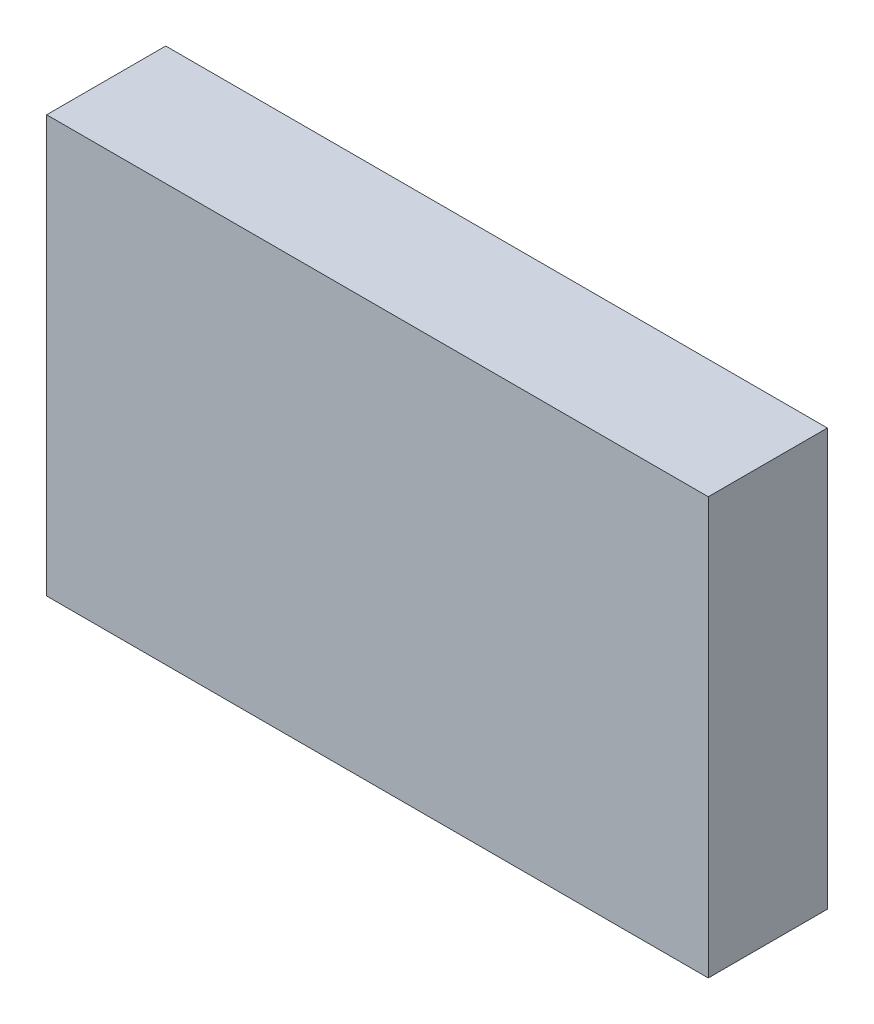
ISO-10303-21;
HEADER;
FILE_DESCRIPTION(('STEP AP214'),'2;1');
FILE_NAME('part.step','',(''),(''),'','','');
FILE_SCHEMA(('AUTOMOTIVE_DESIGN { 1 0 10303 214 1 1 1 1 }'));
ENDSEC;
DATA;
#1=APPLICATION_CONTEXT('core data for automotive mechanical design processes');
#2=APPLICATION_PROTOCOL_DEFINITION('international standard','automotive_design',2000,#1);
#3=PRODUCT_CONTEXT('',#1,'mechanical');
#4=PRODUCT('Part','Part','',(#3));
#5=PRODUCT_RELATED_PRODUCT_CATEGORY('part','',(#4));
#6=PRODUCT_DEFINITION_FORMATION('','',#4);
#7=PRODUCT_DEFINITION_CONTEXT('part definition',#1,'design');
#8=PRODUCT_DEFINITION('design','',#6,#7);
#9=PRODUCT_DEFINITION_SHAPE('','',#8);
#10=(LENGTH_UNIT() NAMED_UNIT(*) SI_UNIT(.MILLI.,.METRE.));
#11=(NAMED_UNIT(*) PLANE_ANGLE_UNIT() SI_UNIT($,.RADIAN.));
#12=(NAMED_UNIT(*) SI_UNIT($,.STERADIAN.) SOLID_ANGLE_UNIT());
#13=UNCERTAINTY_MEASURE_WITH_UNIT(LENGTH_MEASURE(1.E-05),#10,'distance_accuracy_value','');
#14=(GEOMETRIC_REPRESENTATION_CONTEXT(3) GLOBAL_UNCERTAINTY_ASSIGNED_CONTEXT((#13)) GLOBAL_UNIT_ASSIGNED_CONTEXT((#10,
#11,#12)) REPRESENTATION_CONTEXT('',''));
#15=CARTESIAN_POINT('',(0.,0.,0.));
#16=DIRECTION('',(0.,0.,1.));
#17=DIRECTION('',(1.,0.,0.));
#18=AXIS2_PLACEMENT_3D('',#15,#16,#17);
#19=CARTESIAN_POINT('',(3.175,2.,1.143));
#20=DIRECTION('',(-1.,0.,0.));
#21=DIRECTION('',(0.,-1.,0.));
#22=AXIS2_PLACEMENT_3D('',#19,#20,#21);
#23=PLANE('',#22);
#24=DIRECTION('',(0.,1.,0.));
#25=VECTOR('',#24,1.);
#26=CARTESIAN_POINT('',(3.175,2.,0.));
#27=LINE('',#26,#25);
#28=CARTESIAN_POINT('',(3.175,-2.,0.));
#29=VERTEX_POINT('',#28);
#30=CARTESIAN_POINT('',(3.175,2.,0.));
#31=VERTEX_POINT('',#30);
#32=EDGE_CURVE('E96',#29,#31,#27,.T.);
#33=ORIENTED_EDGE('',*,*,#32,.T.);
#34=DIRECTION('',(0.,0.,-1.));
#35=VECTOR('',#34,1.);
#36=CARTESIAN_POINT('',(3.175,2.,1.143));
#37=LINE('',#36,#35);
#38=CARTESIAN_POINT('',(3.175,2.,1.143));
#39=VERTEX_POINT('',#38);
#40=EDGE_CURVE('E11',#39,#31,#37,.T.);
#41=ORIENTED_EDGE('',*,*,#40,.F.);
#42=DIRECTION('',(0.,1.,0.));
#43=VECTOR('',#42,1.);
#44=CARTESIAN_POINT('',(3.175,2.,1.143));
#45=LINE('',#44,#43);
#46=CARTESIAN_POINT('',(3.175,-2.,1.143));
#47=VERTEX_POINT('',#46);
#48=EDGE_CURVE('E84',#47,#39,#45,.T.);
#49=ORIENTED_EDGE('',*,*,#48,.F.);
#50=DIRECTION('',(0.,0.,-1.));
#51=VECTOR('',#50,1.);
#52=CARTESIAN_POINT('',(3.175,-2.,1.143));
#53=LINE('',#52,#51);
#54=EDGE_CURVE('E92',#47,#29,#53,.T.);
#55=ORIENTED_EDGE('',*,*,#54,.T.);
#56=EDGE_LOOP('',(#33,#41,#49,#55));
#57=FACE_BOUND('',#56,.T.);
#58=ADVANCED_FACE('F33',(#57),#23,.F.);
#59=CARTESIAN_POINT('',(-3.175,2.,1.143));
#60=DIRECTION('',(0.,-1.,0.));
#61=DIRECTION('',(0.,0.,-1.));
#62=AXIS2_PLACEMENT_3D('',#59,#60,#61);
#63=PLANE('',#62);
#64=DIRECTION('',(-1.,0.,0.));
#65=VECTOR('',#64,1.);
#66=CARTESIAN_POINT('',(-3.175,2.,0.));
#67=LINE('',#66,#65);
#68=CARTESIAN_POINT('',(-3.175,2.,0.));
#69=VERTEX_POINT('',#68);
#70=EDGE_CURVE('E88',#31,#69,#67,.T.);
#71=ORIENTED_EDGE('',*,*,#70,.T.);
#72=DIRECTION('',(0.,0.,-1.));
#73=VECTOR('',#72,1.);
#74=CARTESIAN_POINT('',(-3.175,2.,1.143));
#75=LINE('',#74,#73);
#76=CARTESIAN_POINT('',(-3.175,2.,1.143));
#77=VERTEX_POINT('',#76);
#78=EDGE_CURVE('E41',#77,#69,#75,.T.);
#79=ORIENTED_EDGE('',*,*,#78,.F.);
#80=DIRECTION('',(-1.,0.,0.));
#81=VECTOR('',#80,1.);
#82=CARTESIAN_POINT('',(-3.175,2.,1.143));
#83=LINE('',#82,#81);
#84=EDGE_CURVE('E79',#39,#77,#83,.T.);
#85=ORIENTED_EDGE('',*,*,#84,.F.);
#86=ORIENTED_EDGE('',*,*,#40,.T.);
#87=EDGE_LOOP('',(#71,#79,#85,#86));
#88=FACE_BOUND('',#87,.T.);
#89=ADVANCED_FACE('F87',(#88),#63,.F.);
#90=CARTESIAN_POINT('',(-3.175,2.,1.143));
#91=DIRECTION('',(1.,0.,0.));
#92=DIRECTION('',(0.,1.,0.));
#93=AXIS2_PLACEMENT_3D('',#90,#91,#92);
#94=PLANE('',#93);
#95=DIRECTION('',(0.,-1.,0.));
#96=VECTOR('',#95,1.);
#97=CARTESIAN_POINT('',(-3.175,2.,0.));
#98=LINE('',#97,#96);
#99=CARTESIAN_POINT('',(-3.175,-2.,0.));
#100=VERTEX_POINT('',#99);
#101=EDGE_CURVE('E66',#69,#100,#98,.T.);
#102=ORIENTED_EDGE('',*,*,#101,.T.);
#103=DIRECTION('',(0.,0.,-1.));
#104=VECTOR('',#103,1.);
#105=CARTESIAN_POINT('',(-3.175,-2.,1.143));
#106=LINE('',#105,#104);
#107=CARTESIAN_POINT('',(-3.175,-2.,1.143));
#108=VERTEX_POINT('',#107);
#109=EDGE_CURVE('E89',#108,#100,#106,.T.);
#110=ORIENTED_EDGE('',*,*,#109,.F.);
#111=DIRECTION('',(0.,-1.,0.));
#112=VECTOR('',#111,1.);
#113=CARTESIAN_POINT('',(-3.175,2.,1.143));
#114=LINE('',#113,#112);
#115=EDGE_CURVE('E82',#77,#108,#114,.T.);
#116=ORIENTED_EDGE('',*,*,#115,.F.);
#117=ORIENTED_EDGE('',*,*,#78,.T.);
#118=EDGE_LOOP('',(#102,#110,#116,#117));
#119=FACE_BOUND('',#118,.T.);
#120=ADVANCED_FACE('F90',(#119),#94,.F.);
#121=CARTESIAN_POINT('',(-3.175,-2.,1.143));
#122=DIRECTION('',(0.,1.,0.));
#123=DIRECTION('',(0.,0.,1.));
#124=AXIS2_PLACEMENT_3D('',#121,#122,#123);
#125=PLANE('',#124);
#126=DIRECTION('',(1.,0.,0.));
#127=VECTOR('',#126,1.);
#128=CARTESIAN_POINT('',(-3.175,-2.,0.));
#129=LINE('',#128,#127);
#130=EDGE_CURVE('E72',#100,#29,#129,.T.);
#131=ORIENTED_EDGE('',*,*,#130,.T.);
#132=ORIENTED_EDGE('',*,*,#54,.F.);
#133=DIRECTION('',(1.,0.,0.));
#134=VECTOR('',#133,1.);
#135=CARTESIAN_POINT('',(-3.175,-2.,1.143));
#136=LINE('',#135,#134);
#137=EDGE_CURVE('E49',#108,#47,#136,.T.);
#138=ORIENTED_EDGE('',*,*,#137,.F.);
#139=ORIENTED_EDGE('',*,*,#109,.T.);
#140=EDGE_LOOP('',(#131,#132,#138,#139));
#141=FACE_BOUND('',#140,.T.);
#142=ADVANCED_FACE('F103',(#141),#125,.F.);
#143=CARTESIAN_POINT('',(0.,0.,1.143));
#144=DIRECTION('',(0.,0.,1.));
#145=DIRECTION('',(1.,0.,0.));
#146=AXIS2_PLACEMENT_3D('',#143,#144,#145);
#147=PLANE('',#146);
#148=ORIENTED_EDGE('',*,*,#48,.T.);
#149=ORIENTED_EDGE('',*,*,#84,.T.);
#150=ORIENTED_EDGE('',*,*,#115,.T.);
#151=ORIENTED_EDGE('',*,*,#137,.T.);
#152=EDGE_LOOP('',(#148,#149,#150,#151));
#153=FACE_BOUND('',#152,.T.);
#154=ADVANCED_FACE('F80',(#153),#147,.T.);
#155=CARTESIAN_POINT('',(0.,0.,0.));
#156=DIRECTION('',(0.,0.,1.));
#157=DIRECTION('',(1.,0.,0.));
#158=AXIS2_PLACEMENT_3D('',#155,#156,#157);
#159=PLANE('',#158);
#160=ORIENTED_EDGE('',*,*,#32,.F.);
#161=ORIENTED_EDGE('',*,*,#130,.F.);
#162=ORIENTED_EDGE('',*,*,#101,.F.);
#163=ORIENTED_EDGE('',*,*,#70,.F.);
#164=EDGE_LOOP('',(#160,#161,#162,#163));
#165=FACE_BOUND('',#164,.T.);
#166=ADVANCED_FACE('F106',(#165),#159,.F.);
#167=CLOSED_SHELL('',(#58,#89,#120,#142,#154,#166));
#168=MANIFOLD_SOLID_BREP('B2',#167);
#169=ADVANCED_BREP_SHAPE_REPRESENTATION('',(#18,#168),#14);
#170=SHAPE_DEFINITION_REPRESENTATION(#9,#169);
ENDSEC;
END-ISO-10303-21;
